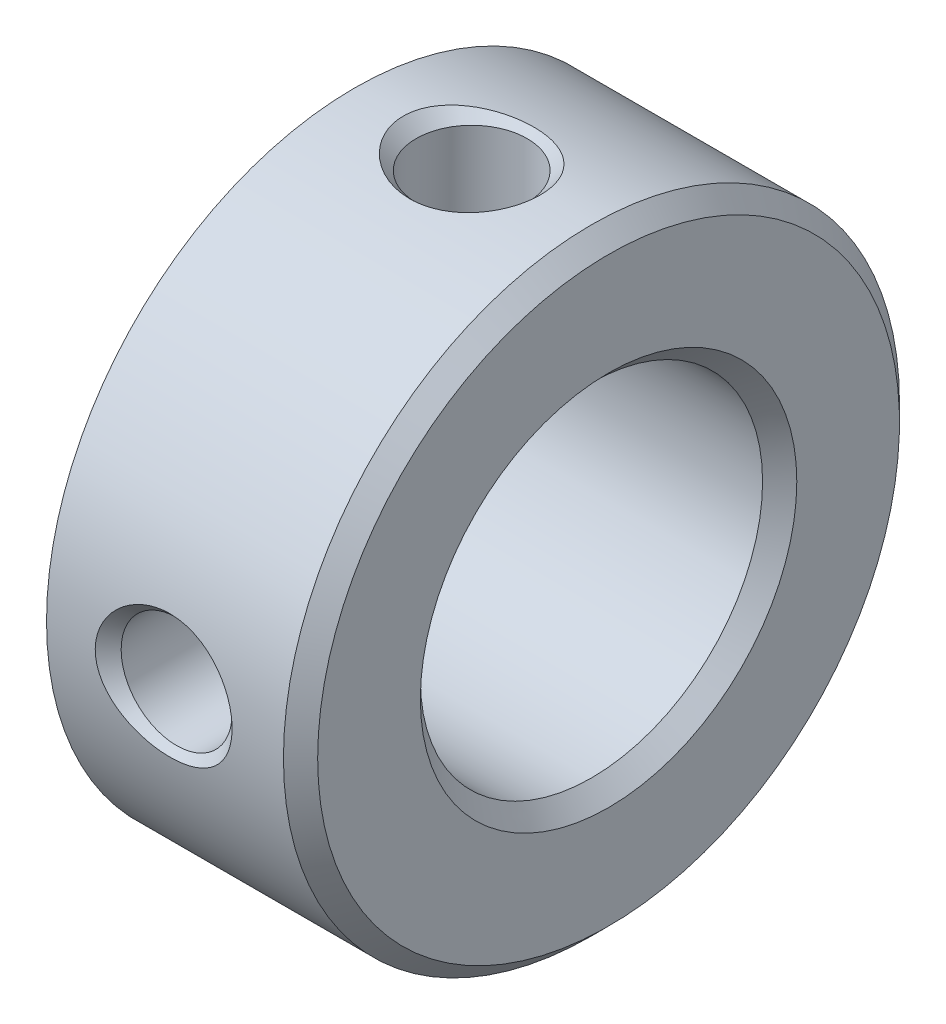
ISO-10303-21;
HEADER;
FILE_DESCRIPTION(('STEP AP214'),'2;1');
FILE_NAME('part.step','',(''),(''),'','','');
FILE_SCHEMA(('AUTOMOTIVE_DESIGN { 1 0 10303 214 1 1 1 1 }'));
ENDSEC;
DATA;
#1=APPLICATION_CONTEXT('core data for automotive mechanical design processes');
#2=APPLICATION_PROTOCOL_DEFINITION('international standard','automotive_design',2000,#1);
#3=PRODUCT_CONTEXT('',#1,'mechanical');
#4=PRODUCT('Part','Part','',(#3));
#5=PRODUCT_RELATED_PRODUCT_CATEGORY('part','',(#4));
#6=PRODUCT_DEFINITION_FORMATION('','',#4);
#7=PRODUCT_DEFINITION_CONTEXT('part definition',#1,'design');
#8=PRODUCT_DEFINITION('design','',#6,#7);
#9=PRODUCT_DEFINITION_SHAPE('','',#8);
#10=(LENGTH_UNIT() NAMED_UNIT(*) SI_UNIT(.MILLI.,.METRE.));
#11=(NAMED_UNIT(*) PLANE_ANGLE_UNIT() SI_UNIT($,.RADIAN.));
#12=(NAMED_UNIT(*) SI_UNIT($,.STERADIAN.) SOLID_ANGLE_UNIT());
#13=UNCERTAINTY_MEASURE_WITH_UNIT(LENGTH_MEASURE(1.E-05),#10,'distance_accuracy_value','');
#14=(GEOMETRIC_REPRESENTATION_CONTEXT(3) GLOBAL_UNCERTAINTY_ASSIGNED_CONTEXT((#13)) GLOBAL_UNIT_ASSIGNED_CONTEXT((#10,
#11,#12)) REPRESENTATION_CONTEXT('',''));
#15=CARTESIAN_POINT('',(0.,0.,0.));
#16=DIRECTION('',(0.,0.,1.));
#17=DIRECTION('',(1.,0.,0.));
#18=AXIS2_PLACEMENT_3D('',#15,#16,#17);
#19=CARTESIAN_POINT('',(4.0000000000191,0.,0.));
#20=DIRECTION('',(1.,0.,0.));
#21=DIRECTION('',(0.,0.,-1.));
#22=AXIS2_PLACEMENT_3D('',#19,#20,#21);
#23=CONICAL_SURFACE('',#22,5.49999999998363,0.785398163397448);
#24=CARTESIAN_POINT('',(4.0000000000191,0.,0.));
#25=DIRECTION('',(1.,0.,0.));
#26=DIRECTION('',(0.,0.,-1.));
#27=AXIS2_PLACEMENT_3D('',#24,#25,#26);
#28=CIRCLE('',#27,5.49999999998363);
#29=CARTESIAN_POINT('',(4.0000000000191,0.,-5.49999999998363));
#30=VERTEX_POINT('',#29);
#31=EDGE_CURVE('E116',#30,#30,#28,.F.);
#32=ORIENTED_EDGE('',*,*,#31,.F.);
#33=EDGE_LOOP('',(#32));
#34=FACE_BOUND('',#33,.T.);
#35=CARTESIAN_POINT('',(3.5,0.,0.));
#36=DIRECTION('',(1.,0.,0.));
#37=DIRECTION('',(0.,0.,-1.));
#38=AXIS2_PLACEMENT_3D('',#35,#36,#37);
#39=CIRCLE('',#38,5.);
#40=CARTESIAN_POINT('',(3.5,0.,-5.));
#41=VERTEX_POINT('',#40);
#42=EDGE_CURVE('E117',#41,#41,#39,.F.);
#43=ORIENTED_EDGE('',*,*,#42,.T.);
#44=EDGE_LOOP('',(#43));
#45=FACE_BOUND('',#44,.T.);
#46=ADVANCED_FACE('F15',(#34,#45),#23,.F.);
#47=CARTESIAN_POINT('',(0.,0.,6.3105));
#48=DIRECTION('',(0.,0.,1.));
#49=DIRECTION('',(1.,0.,0.));
#50=AXIS2_PLACEMENT_3D('',#47,#48,#49);
#51=CYLINDRICAL_SURFACE('',#50,1.621);
#52=CARTESIAN_POINT('',(0.,1.621,4.7299428114936));
#53=CARTESIAN_POINT('',(0.0883242228498081,1.62099495666801,4.72994698899165));
#54=CARTESIAN_POINT('',(0.176741908427207,1.61374671481636,4.73244787339607));
#55=CARTESIAN_POINT('',(0.351055857519975,1.5850020391228,4.74215007953435));
#56=CARTESIAN_POINT('',(0.436947502570778,1.56348101896145,4.74935951189662));
#57=CARTESIAN_POINT('',(0.603524042287424,1.50702106075937,4.7675736609542));
#58=CARTESIAN_POINT('',(0.684221267852952,1.47211537999241,4.77856896392495));
#59=CARTESIAN_POINT('',(0.838610035436139,1.38997281233635,4.80310370751553));
#60=CARTESIAN_POINT('',(0.912302345745859,1.34273727990673,4.81664286864159));
#61=CARTESIAN_POINT('',(1.05335823078501,1.23539208930278,4.84530578877992));
#62=CARTESIAN_POINT('',(1.12042483757003,1.17490221978386,4.86046757232822));
#63=CARTESIAN_POINT('',(1.24366524737992,1.04357520200886,4.89034562081855));
#64=CARTESIAN_POINT('',(1.29983684125703,0.972735960337547,4.90506179489632));
#65=CARTESIAN_POINT('',(1.40101358464609,0.82057820227296,4.93282554667559));
#66=CARTESIAN_POINT('',(1.44571136220709,0.739045426104684,4.94582339715119));
#67=CARTESIAN_POINT('',(1.52064193072922,0.569125871752056,4.96824175614928));
#68=CARTESIAN_POINT('',(1.55087846670559,0.480740874978997,4.97766319072258));
#69=CARTESIAN_POINT('',(1.59503214573903,0.302725730233391,4.99159902806261));
#70=CARTESIAN_POINT('',(1.60945562253032,0.213233280255262,4.99626531874226));
#71=CARTESIAN_POINT('',(1.62318116381357,0.0329849354117729,5.00070305142235));
#72=CARTESIAN_POINT('',(1.62248691454288,-0.0577706460636826,5.00047568666956));
#73=CARTESIAN_POINT('',(1.60632322734271,-0.234393693235526,4.99525592640369));
#74=CARTESIAN_POINT('',(1.59140333710298,-0.320317537198479,4.99044076600698));
#75=CARTESIAN_POINT('',(1.54811738804956,-0.488368815244508,4.97680691751369));
#76=CARTESIAN_POINT('',(1.51975037245378,-0.57049597873195,4.96798794454204));
#77=CARTESIAN_POINT('',(1.45003954655479,-0.729855170497705,4.94710600807936));
#78=CARTESIAN_POINT('',(1.4085344498836,-0.807011181818476,4.93500300803599));
#79=CARTESIAN_POINT('',(1.3138591862577,-0.9534253809761,4.90882059429379));
#80=CARTESIAN_POINT('',(1.26068652917728,-1.02268187807223,4.8947407589242));
#81=CARTESIAN_POINT('',(1.14140184620216,-1.15459862188282,4.86535445959904));
#82=CARTESIAN_POINT('',(1.07481906527925,-1.21682780413248,4.85002129307937));
#83=CARTESIAN_POINT('',(0.931999110133114,-1.32939386947531,4.82038486203933));
#84=CARTESIAN_POINT('',(0.855757296200298,-1.37972500382847,4.80608209768579));
#85=CARTESIAN_POINT('',(0.694459692640505,-1.4676233887933,4.77998110434209));
#86=CARTESIAN_POINT('',(0.609298497454268,-1.50500850150338,4.76821942684763));
#87=CARTESIAN_POINT('',(0.43350657126083,-1.56470186109034,4.74896913992852));
#88=CARTESIAN_POINT('',(0.342887874176345,-1.58704204554023,4.74147148408145));
#89=CARTESIAN_POINT('',(0.209524086406617,-1.60795244109759,4.73439813615582));
#90=CARTESIAN_POINT('',(0.167793610807641,-1.61283923748477,4.73273299529697));
#91=CARTESIAN_POINT('',(0.0840491474992081,-1.61936422533902,4.73050433607812));
#92=CARTESIAN_POINT('',(0.0420351583430463,-1.62100240021652,4.72994082334374));
#93=CARTESIAN_POINT('',(-0.0883242228498083,-1.62099495666801,4.72994698899165));
#94=CARTESIAN_POINT('',(-0.176741908427207,-1.61374671481636,4.73244787339607));
#95=CARTESIAN_POINT('',(-0.351055857519976,-1.5850020391228,4.74215007953435));
#96=CARTESIAN_POINT('',(-0.436947502570778,-1.56348101896145,4.74935951189662));
#97=CARTESIAN_POINT('',(-0.603524042287424,-1.50702106075937,4.7675736609542));
#98=CARTESIAN_POINT('',(-0.684221267852951,-1.47211537999241,4.77856896392495));
#99=CARTESIAN_POINT('',(-0.838610035436139,-1.38997281233635,4.80310370751553));
#100=CARTESIAN_POINT('',(-0.912302345745859,-1.34273727990673,4.81664286864159));
#101=CARTESIAN_POINT('',(-1.05335823078501,-1.23539208930278,4.84530578877992));
#102=CARTESIAN_POINT('',(-1.12042483757003,-1.17490221978386,4.86046757232821));
#103=CARTESIAN_POINT('',(-1.24366524737992,-1.04357520200886,4.89034562081855));
#104=CARTESIAN_POINT('',(-1.29983684125703,-0.972735960337547,4.90506179489632));
#105=CARTESIAN_POINT('',(-1.40101358464609,-0.82057820227296,4.93282554667559));
#106=CARTESIAN_POINT('',(-1.44571136220709,-0.739045426104684,4.94582339715119));
#107=CARTESIAN_POINT('',(-1.52064193072922,-0.569125871752056,4.96824175614928));
#108=CARTESIAN_POINT('',(-1.55087846670559,-0.480740874978997,4.97766319072258));
#109=CARTESIAN_POINT('',(-1.59503214573903,-0.302725730233391,4.99159902806261));
#110=CARTESIAN_POINT('',(-1.60945562253032,-0.213233280255263,4.99626531874226));
#111=CARTESIAN_POINT('',(-1.62318116381357,-0.0329849354117731,5.00070305142235));
#112=CARTESIAN_POINT('',(-1.62248691454288,0.0577706460636825,5.00047568666956));
#113=CARTESIAN_POINT('',(-1.60632322734271,0.234393693235526,4.99525592640369));
#114=CARTESIAN_POINT('',(-1.59140333710298,0.320317537198478,4.99044076600698));
#115=CARTESIAN_POINT('',(-1.54811738804956,0.488368815244508,4.97680691751369));
#116=CARTESIAN_POINT('',(-1.51975037245378,0.57049597873195,4.96798794454204));
#117=CARTESIAN_POINT('',(-1.45003954655479,0.729855170497706,4.94710600807936));
#118=CARTESIAN_POINT('',(-1.4085344498836,0.807011181818477,4.93500300803599));
#119=CARTESIAN_POINT('',(-1.3138591862577,0.9534253809761,4.90882059429379));
#120=CARTESIAN_POINT('',(-1.26068652917728,1.02268187807223,4.8947407589242));
#121=CARTESIAN_POINT('',(-1.14140184620216,1.15459862188282,4.86535445959903));
#122=CARTESIAN_POINT('',(-1.07481906527925,1.21682780413248,4.85002129307937));
#123=CARTESIAN_POINT('',(-0.931999110133115,1.32939386947531,4.82038486203933));
#124=CARTESIAN_POINT('',(-0.855757296200298,1.37972500382847,4.80608209768579));
#125=CARTESIAN_POINT('',(-0.694459692640505,1.4676233887933,4.77998110434209));
#126=CARTESIAN_POINT('',(-0.609298497454268,1.50500850150338,4.76821942684763));
#127=CARTESIAN_POINT('',(-0.43350657126083,1.56470186109034,4.74896913992852));
#128=CARTESIAN_POINT('',(-0.342887874176345,1.58704204554023,4.74147148408145));
#129=CARTESIAN_POINT('',(-0.209524086406617,1.60795244109759,4.73439813615582));
#130=CARTESIAN_POINT('',(-0.167793610807642,1.61283923748477,4.73273299529697));
#131=CARTESIAN_POINT('',(-0.0840491474992082,1.61936422533902,4.73050433607812));
#132=CARTESIAN_POINT('',(-0.0420351583430463,1.62100240021652,4.72994082334374));
#133=CARTESIAN_POINT('',(0.,1.621,4.7299428114936));
#134=B_SPLINE_CURVE_WITH_KNOTS('',3,(#52,#53,#54,#55,#56,#57,#58,#59,#60,#61,#62,#63,#64,#65,
#66,#67,#68,#69,#70,#71,#72,#73,#74,#75,#76,#77,#78,#79,#80,#81,#82,#83,#84,#85,#86,#87,#88,#89,
#90,#91,#92,#93,#94,#95,#96,#97,#98,#99,#100,#101,#102,#103,#104,#105,#106,#107,#108,#109,#110,
#111,#112,#113,#114,#115,#116,#117,#118,#119,#120,#121,#122,#123,#124,#125,#126,#127,#128,#129,
#130,#131,#132,#133),.UNSPECIFIED.,.T.,.F.,(4,2,2,2,2,2,2,2,2,2,2,2,2,2,2,2,2,2,2,2,2,2,2,2,2,2,
2,2,2,2,2,2,2,2,2,2,2,2,2,2,4),(0.,0.264809590369285,0.530076531290413,0.79468858220667,
1.05927157717112,1.33277097070679,1.60632576301808,1.88658416230314,2.16676994396102,
2.43769548297377,2.70855496147908,2.96935765010709,3.23017889800305,3.49433506090683,
3.75854765574026,4.03452570531058,4.31063682697136,4.59048820588875,4.86974362403357,
4.99577084351573,5.12179870657271,5.386608296942,5.65187523786313,5.91648728877938,
6.18107028374383,6.4545696772795,6.7281244695908,7.00838286887585,7.28856865053373,
7.55949418954648,7.83035366805179,8.0911563566798,8.35197760457576,8.61613376747954,
8.88034636231297,9.15632441188329,9.43243553354407,9.71228691246147,9.99154233060629,
10.1175695500884,10.2435974131454),.UNSPECIFIED.);
#135=CARTESIAN_POINT('',(0.,1.621,4.7299428114936));
#136=VERTEX_POINT('',#135);
#137=EDGE_CURVE('E18',#136,#136,#134,.T.);
#138=ORIENTED_EDGE('',*,*,#137,.T.);
#139=EDGE_LOOP('',(#138));
#140=FACE_BOUND('',#139,.T.);
#141=CARTESIAN_POINT('',(0.,0.,8.62099999994825));
#142=DIRECTION('',(0.,0.,1.));
#143=DIRECTION('',(0.,-1.,0.));
#144=AXIS2_PLACEMENT_3D('',#141,#142,#143);
#145=CIRCLE('',#144,1.62099999994325);
#146=CARTESIAN_POINT('',(0.,-1.62099999994325,8.62099999994825));
#147=VERTEX_POINT('',#146);
#148=EDGE_CURVE('E114',#147,#147,#145,.T.);
#149=ORIENTED_EDGE('',*,*,#148,.T.);
#150=EDGE_LOOP('',(#149));
#151=FACE_BOUND('',#150,.T.);
#152=ADVANCED_FACE('F125',(#140,#151),#51,.F.);
#153=CARTESIAN_POINT('',(-4.0000000000191,0.,0.));
#154=DIRECTION('',(-1.,0.,0.));
#155=DIRECTION('',(0.,0.,1.));
#156=AXIS2_PLACEMENT_3D('',#153,#154,#155);
#157=CONICAL_SURFACE('',#156,5.49999999998363,0.785398163397448);
#158=CARTESIAN_POINT('',(-3.5,0.,0.));
#159=DIRECTION('',(1.,0.,0.));
#160=DIRECTION('',(0.,0.,-1.));
#161=AXIS2_PLACEMENT_3D('',#158,#159,#160);
#162=CIRCLE('',#161,5.);
#163=CARTESIAN_POINT('',(-3.5,0.,-5.));
#164=VERTEX_POINT('',#163);
#165=EDGE_CURVE('E38',#164,#164,#162,.T.);
#166=ORIENTED_EDGE('',*,*,#165,.T.);
#167=EDGE_LOOP('',(#166));
#168=FACE_BOUND('',#167,.T.);
#169=CARTESIAN_POINT('',(-4.0000000000191,0.,0.));
#170=DIRECTION('',(-1.,0.,0.));
#171=DIRECTION('',(0.,0.,1.));
#172=AXIS2_PLACEMENT_3D('',#169,#170,#171);
#173=CIRCLE('',#172,5.49999999998363);
#174=CARTESIAN_POINT('',(-4.0000000000191,0.,5.49999999998363));
#175=VERTEX_POINT('',#174);
#176=EDGE_CURVE('E81',#175,#175,#173,.F.);
#177=ORIENTED_EDGE('',*,*,#176,.F.);
#178=EDGE_LOOP('',(#177));
#179=FACE_BOUND('',#178,.T.);
#180=ADVANCED_FACE('F73',(#168,#179),#157,.F.);
#181=CARTESIAN_POINT('',(0.,0.,0.));
#182=DIRECTION('',(1.,0.,0.));
#183=DIRECTION('',(0.,0.,-1.));
#184=AXIS2_PLACEMENT_3D('',#181,#182,#183);
#185=CYLINDRICAL_SURFACE('',#184,5.);
#186=ORIENTED_EDGE('',*,*,#165,.F.);
#187=EDGE_LOOP('',(#186));
#188=FACE_BOUND('',#187,.T.);
#189=CARTESIAN_POINT('',(0.,4.7299428114936,1.621));
#190=CARTESIAN_POINT('',(0.0883879395672359,4.7299460726129,1.62099615382014));
#191=CARTESIAN_POINT('',(0.176820959564406,4.73244969190483,1.61374112191029));
#192=CARTESIAN_POINT('',(0.351117785997567,4.74215611922495,1.5849843593927));
#193=CARTESIAN_POINT('',(0.436979153964272,4.74936324828994,1.56346952825927));
#194=CARTESIAN_POINT('',(0.603519537278842,4.76757289344653,1.50702334874817));
#195=CARTESIAN_POINT('',(0.684209269290979,4.77856723879521,1.47212086535421));
#196=CARTESIAN_POINT('',(0.838598083385425,4.80310162588651,1.38998007050231));
#197=CARTESIAN_POINT('',(0.912296852067883,4.8166417816749,1.34274120636923));
#198=CARTESIAN_POINT('',(1.0533533252904,4.84530476162284,1.23539608526392));
#199=CARTESIAN_POINT('',(1.12041536289458,4.8604654416043,1.17491132632733));
#200=CARTESIAN_POINT('',(1.24365733591412,4.89034353612307,1.04358462264169));
#201=CARTESIAN_POINT('',(1.29983352875819,4.90506079674867,0.972739130492266));
#202=CARTESIAN_POINT('',(1.40103725259501,4.93283213275176,0.820544465073783));
#203=CARTESIAN_POINT('',(1.44575219604474,4.94583564315422,0.73897759701253));
#204=CARTESIAN_POINT('',(1.52067124435153,4.96825050056049,0.569034641163643));
#205=CARTESIAN_POINT('',(1.55089256871116,4.97766610751451,0.480666779111124));
#206=CARTESIAN_POINT('',(1.58911672955297,4.98973307709506,0.32658715025848));
#207=CARTESIAN_POINT('',(1.60104891603746,4.99356184924025,0.261915386126397));
#208=CARTESIAN_POINT('',(1.61699167239445,4.99869621532877,0.131503946543916));
#209=CARTESIAN_POINT('',(1.62100277776454,5.00000197983763,0.0657643435867669));
#210=CARTESIAN_POINT('',(1.62099626084217,4.99999733493417,-0.0885255955464695));
#211=CARTESIAN_POINT('',(1.61371938986869,4.99762504507006,-0.177096020963262));
#212=CARTESIAN_POINT('',(1.58486797625319,4.9883850266478,-0.351678867713105));
#213=CARTESIAN_POINT('',(1.56328082611174,4.98151333413636,-0.437688963488835));
#214=CARTESIAN_POINT('',(1.50662347558519,4.96402578679964,-0.604544986591142));
#215=CARTESIAN_POINT('',(1.47157888655898,4.95341704724089,-0.685400385252581));
#216=CARTESIAN_POINT('',(1.38910254724635,4.9295447692433,-0.840071913564747));
#217=CARTESIAN_POINT('',(1.341670556754,4.91628117932504,-0.913887906675423));
#218=CARTESIAN_POINT('',(1.23412056820324,4.88801042598162,-1.05483523567841));
#219=CARTESIAN_POINT('',(1.17366761131566,4.87296317580924,-1.12170289832987));
#220=CARTESIAN_POINT('',(1.04248874357489,4.84304346253043,-1.24456315018154));
#221=CARTESIAN_POINT('',(0.97175875754015,4.82817107130195,-1.30055140465536));
#222=CARTESIAN_POINT('',(0.819688056992398,4.79984606653351,-1.40153822316147));
#223=CARTESIAN_POINT('',(0.738110234518086,4.78644334660164,-1.4461947300554));
#224=CARTESIAN_POINT('',(0.56814564903648,4.76320273836648,-1.52100253546362));
#225=CARTESIAN_POINT('',(0.479767423205628,4.7533604660691,-1.55117168741765));
#226=CARTESIAN_POINT('',(0.325820975673771,4.74072730436039,-1.58926692611162));
#227=CARTESIAN_POINT('',(0.261304146071917,4.73670911879916,-1.6011423667579));
#228=CARTESIAN_POINT('',(0.13119976510088,4.73131577176562,-1.61701000375735));
#229=CARTESIAN_POINT('',(0.0656123031511083,4.72994039069333,-1.62100285510353));
#230=CARTESIAN_POINT('',(-0.088387939567236,4.72994607261289,-1.62099615382014));
#231=CARTESIAN_POINT('',(-0.176820959564406,4.73244969190483,-1.61374112191029));
#232=CARTESIAN_POINT('',(-0.351117785997567,4.74215611922495,-1.5849843593927));
#233=CARTESIAN_POINT('',(-0.436979153964272,4.74936324828994,-1.56346952825927));
#234=CARTESIAN_POINT('',(-0.603519537278842,4.76757289344653,-1.50702334874817));
#235=CARTESIAN_POINT('',(-0.684209269290978,4.77856723879522,-1.47212086535421));
#236=CARTESIAN_POINT('',(-0.838598083385424,4.80310162588651,-1.38998007050231));
#237=CARTESIAN_POINT('',(-0.912296852067883,4.8166417816749,-1.34274120636923));
#238=CARTESIAN_POINT('',(-1.0533533252904,4.84530476162284,-1.23539608526392));
#239=CARTESIAN_POINT('',(-1.12041536289458,4.8604654416043,-1.17491132632733));
#240=CARTESIAN_POINT('',(-1.24365733591412,4.89034353612307,-1.04358462264169));
#241=CARTESIAN_POINT('',(-1.29983352875819,4.90506079674867,-0.972739130492266));
#242=CARTESIAN_POINT('',(-1.40103725259501,4.93283213275176,-0.820544465073783));
#243=CARTESIAN_POINT('',(-1.44575219604474,4.94583564315422,-0.73897759701253));
#244=CARTESIAN_POINT('',(-1.52067124435153,4.96825050056049,-0.569034641163643));
#245=CARTESIAN_POINT('',(-1.55089256871116,4.97766610751451,-0.480666779111124));
#246=CARTESIAN_POINT('',(-1.58911672955297,4.98973307709506,-0.32658715025848));
#247=CARTESIAN_POINT('',(-1.60104891603746,4.99356184924025,-0.261915386126397));
#248=CARTESIAN_POINT('',(-1.61699167239445,4.99869621532877,-0.131503946543916));
#249=CARTESIAN_POINT('',(-1.62100277776454,5.00000197983763,-0.0657643435867674));
#250=CARTESIAN_POINT('',(-1.62099626084217,4.99999733493417,0.088525595546469));
#251=CARTESIAN_POINT('',(-1.61371938986869,4.99762504507006,0.177096020963261));
#252=CARTESIAN_POINT('',(-1.58486797625319,4.9883850266478,0.351678867713105));
#253=CARTESIAN_POINT('',(-1.56328082611174,4.98151333413636,0.437688963488834));
#254=CARTESIAN_POINT('',(-1.50662347558519,4.96402578679964,0.604544986591141));
#255=CARTESIAN_POINT('',(-1.47157888655898,4.95341704724089,0.68540038525258));
#256=CARTESIAN_POINT('',(-1.38910254724635,4.9295447692433,0.840071913564747));
#257=CARTESIAN_POINT('',(-1.341670556754,4.91628117932504,0.913887906675423));
#258=CARTESIAN_POINT('',(-1.23412056820324,4.88801042598162,1.05483523567841));
#259=CARTESIAN_POINT('',(-1.17366761131566,4.87296317580924,1.12170289832987));
#260=CARTESIAN_POINT('',(-1.04248874357489,4.84304346253043,1.24456315018154));
#261=CARTESIAN_POINT('',(-0.971758757540151,4.82817107130195,1.30055140465536));
#262=CARTESIAN_POINT('',(-0.819688056992398,4.79984606653351,1.40153822316147));
#263=CARTESIAN_POINT('',(-0.738110234518087,4.78644334660164,1.44619473005539));
#264=CARTESIAN_POINT('',(-0.568145649036481,4.76320273836648,1.52100253546362));
#265=CARTESIAN_POINT('',(-0.479767423205629,4.7533604660691,1.55117168741765));
#266=CARTESIAN_POINT('',(-0.325820975673772,4.74072730436039,1.58926692611162));
#267=CARTESIAN_POINT('',(-0.261304146071917,4.73670911879916,1.6011423667579));
#268=CARTESIAN_POINT('',(-0.131199765100881,4.73131577176562,1.61701000375735));
#269=CARTESIAN_POINT('',(-0.0656123031511085,4.72994039069334,1.62100285510353));
#270=CARTESIAN_POINT('',(0.,4.7299428114936,1.621));
#271=B_SPLINE_CURVE_WITH_KNOTS('',3,(#189,#190,#191,#192,#193,#194,#195,#196,#197,#198,#199,
#200,#201,#202,#203,#204,#205,#206,#207,#208,#209,#210,#211,#212,#213,#214,#215,#216,#217,#218,
#219,#220,#221,#222,#223,#224,#225,#226,#227,#228,#229,#230,#231,#232,#233,#234,#235,#236,#237,
#238,#239,#240,#241,#242,#243,#244,#245,#246,#247,#248,#249,#250,#251,#252,#253,#254,#255,#256,
#257,#258,#259,#260,#261,#262,#263,#264,#265,#266,#267,#268,#269,#270),.UNSPECIFIED.,.T.,.F.,(4,
2,2,2,2,2,2,2,2,2,2,2,2,2,2,2,2,2,2,2,2,2,2,2,2,2,2,2,2,2,2,2,2,2,2,2,2,2,2,2,4),(0.,
0.26491640290383,0.53007652338082,0.794668119502865,1.05927157147554,1.33275173579368,
1.6063257568732,1.88671483229574,2.1667699541857,2.36389319006473,2.56100309914778,
2.82633338510532,3.09189774092573,3.35695917612807,3.62202575155762,3.89496544056384,
4.16801365604414,4.44852213470529,4.72868403693406,4.92535362690224,5.12200687419063,
5.38692327709447,5.65208339757145,5.9166749936935,6.18127844566617,6.45475860998431,
6.72833263106384,7.00872170648637,7.28877682837634,7.48590006425537,7.68300997333841,
7.94834025929596,8.21390461511636,8.4789660503187,8.74403262574825,9.01697231475448,
9.29002053023477,9.57052900889592,9.8506909111247,10.0473605010929,10.2440137483813),.UNSPECIFIED.);
#272=CARTESIAN_POINT('',(0.,4.7299428114936,1.621));
#273=VERTEX_POINT('',#272);
#274=EDGE_CURVE('E76',#273,#273,#271,.T.);
#275=ORIENTED_EDGE('',*,*,#274,.T.);
#276=EDGE_LOOP('',(#275));
#277=FACE_BOUND('',#276,.T.);
#278=ORIENTED_EDGE('',*,*,#42,.F.);
#279=EDGE_LOOP('',(#278));
#280=FACE_BOUND('',#279,.T.);
#281=ORIENTED_EDGE('',*,*,#137,.F.);
#282=EDGE_LOOP('',(#281));
#283=FACE_BOUND('',#282,.T.);
#284=ADVANCED_FACE('F68',(#188,#277,#280,#283),#185,.F.);
#285=CARTESIAN_POINT('',(4.,7.,0.));
#286=DIRECTION('',(1.,0.,0.));
#287=DIRECTION('',(0.,0.,-1.));
#288=AXIS2_PLACEMENT_3D('',#285,#286,#287);
#289=PLANE('',#288);
#290=ORIENTED_EDGE('',*,*,#31,.T.);
#291=EDGE_LOOP('',(#290));
#292=FACE_BOUND('',#291,.T.);
#293=CARTESIAN_POINT('',(4.,0.,0.));
#294=DIRECTION('',(-1.,0.,0.));
#295=DIRECTION('',(0.,0.,1.));
#296=AXIS2_PLACEMENT_3D('',#293,#294,#295);
#297=CIRCLE('',#296,8.5);
#298=CARTESIAN_POINT('',(4.,0.,8.5));
#299=VERTEX_POINT('',#298);
#300=EDGE_CURVE('E56',#299,#299,#297,.T.);
#301=ORIENTED_EDGE('',*,*,#300,.F.);
#302=EDGE_LOOP('',(#301));
#303=FACE_BOUND('',#302,.T.);
#304=ADVANCED_FACE('F64',(#292,#303),#289,.T.);
#305=CARTESIAN_POINT('',(0.,0.,9.00227399995401));
#306=DIRECTION('',(0.,0.,1.));
#307=DIRECTION('',(1.,0.,0.));
#308=AXIS2_PLACEMENT_3D('',#305,#306,#307);
#309=CONICAL_SURFACE('',#308,2.00227399994901,0.785398163397448);
#310=ORIENTED_EDGE('',*,*,#148,.F.);
#311=EDGE_LOOP('',(#310));
#312=FACE_BOUND('',#311,.T.);
#313=CARTESIAN_POINT('',(0.,1.81507290636318,8.81507290636818));
#314=CARTESIAN_POINT('',(0.120187723832694,1.81507022283642,8.81507478505047));
#315=CARTESIAN_POINT('',(0.240413387361276,1.80515481301193,8.81713291455179));
#316=CARTESIAN_POINT('',(0.477512070458263,1.76564965935597,8.82512758241663));
#317=CARTESIAN_POINT('',(0.594383192532897,1.73604900076806,8.83106627237831));
#318=CARTESIAN_POINT('',(0.821177849482622,1.65773178546549,8.84610126068527));
#319=CARTESIAN_POINT('',(0.931109981133526,1.60903944358785,8.85519355749065));
#320=CARTESIAN_POINT('',(1.14072719976992,1.49338434129233,8.87542872898206));
#321=CARTESIAN_POINT('',(1.24041383423559,1.42642434562107,8.88657129328413));
#322=CARTESIAN_POINT('',(1.42273812205556,1.27813502819688,8.90908453577714));
#323=CARTESIAN_POINT('',(1.50584639926415,1.19738317793663,8.92043397490782));
#324=CARTESIAN_POINT('',(1.65576270709495,1.02174937565431,8.94224921460266));
#325=CARTESIAN_POINT('',(1.72257447872874,0.92687067464871,8.95271521760621));
#326=CARTESIAN_POINT('',(1.83149910595014,0.734437449977917,8.97045781460458));
#327=CARTESIAN_POINT('',(1.87525234483871,0.637829870705439,8.97793238474492));
#328=CARTESIAN_POINT('',(1.94389621755219,0.438113417507654,8.98988179883252));
#329=CARTESIAN_POINT('',(1.96884200112136,0.335024519735889,8.99436540878549));
#330=CARTESIAN_POINT('',(1.98911233350217,0.192434890260843,8.99802471122645));
#331=CARTESIAN_POINT('',(1.99318911685877,0.154073810398632,8.99876331169823));
#332=CARTESIAN_POINT('',(1.99863463839297,0.0771489082677726,8.99975151743143));
#333=CARTESIAN_POINT('',(2.00000309572124,0.0385850653886114,9.00000107197951));
#334=CARTESIAN_POINT('',(1.99999200150595,-0.0996929956484287,8.99999723030538));
#335=CARTESIAN_POINT('',(1.99082805279401,-0.199527664445766,8.99832137621677));
#336=CARTESIAN_POINT('',(1.95464240230793,-0.39591310387582,8.99182733038328));
#337=CARTESIAN_POINT('',(1.92758428756366,-0.492456755474151,8.98700273149773));
#338=CARTESIAN_POINT('',(1.85993213201227,-0.671514074997421,8.97532527411032));
#339=CARTESIAN_POINT('',(1.82062016447572,-0.754529998389324,8.96866963455526));
#340=CARTESIAN_POINT('',(1.72971085194803,-0.913302572892093,8.95389531888979));
#341=CARTESIAN_POINT('',(1.67811879335801,-0.989062328051585,8.94577727268891));
#342=CARTESIAN_POINT('',(1.55985193009782,-1.13764445262415,8.92814650664277));
#343=CARTESIAN_POINT('',(1.49231087561684,-1.20976900976823,8.91857432729899));
#344=CARTESIAN_POINT('',(1.34700220345799,-1.34288337441935,8.89950541834044));
#345=CARTESIAN_POINT('',(1.26922831625565,-1.40386630043171,8.89000873879702));
#346=CARTESIAN_POINT('',(1.09733151445815,-1.51931907533833,8.87104471869932));
#347=CARTESIAN_POINT('',(1.00235152469207,-1.57252985352077,8.86167506587933));
#348=CARTESIAN_POINT('',(0.805162669578235,-1.66360394330228,8.84503095343481));
#349=CARTESIAN_POINT('',(0.702954260809504,-1.70146822323921,8.83775636162389));
#350=CARTESIAN_POINT('',(0.501368944070869,-1.75917197827863,8.82644400021133));
#351=CARTESIAN_POINT('',(0.402315305510119,-1.78011007593777,8.8222113915609));
#352=CARTESIAN_POINT('',(0.202183563213046,-1.80806254638457,8.81652487928484));
#353=CARTESIAN_POINT('',(0.101105205876096,-1.8150751638194,8.81507132596917));
#354=CARTESIAN_POINT('',(-0.120187723832694,-1.81507022283642,8.81507478505047));
#355=CARTESIAN_POINT('',(-0.240413387361277,-1.80515481301193,8.81713291455179));
#356=CARTESIAN_POINT('',(-0.477512070458263,-1.76564965935597,8.82512758241663));
#357=CARTESIAN_POINT('',(-0.594383192532898,-1.73604900076806,8.83106627237831));
#358=CARTESIAN_POINT('',(-0.821177849482623,-1.65773178546549,8.84610126068527));
#359=CARTESIAN_POINT('',(-0.931109981133527,-1.60903944358786,8.85519355749065));
#360=CARTESIAN_POINT('',(-1.14072719976992,-1.49338434129233,8.87542872898206));
#361=CARTESIAN_POINT('',(-1.24041383423559,-1.42642434562107,8.88657129328413));
#362=CARTESIAN_POINT('',(-1.42273812205556,-1.27813502819688,8.90908453577714));
#363=CARTESIAN_POINT('',(-1.50584639926415,-1.19738317793663,8.92043397490782));
#364=CARTESIAN_POINT('',(-1.65576270709496,-1.02174937565431,8.94224921460266));
#365=CARTESIAN_POINT('',(-1.72257447872874,-0.92687067464871,8.95271521760621));
#366=CARTESIAN_POINT('',(-1.83149910595014,-0.734437449977917,8.97045781460458));
#367=CARTESIAN_POINT('',(-1.87525234483871,-0.63782987070544,8.97793238474492));
#368=CARTESIAN_POINT('',(-1.94389621755219,-0.438113417507655,8.98988179883252));
#369=CARTESIAN_POINT('',(-1.96884200112136,-0.33502451973589,8.99436540878549));
#370=CARTESIAN_POINT('',(-1.98911233350216,-0.192434890260843,8.99802471122645));
#371=CARTESIAN_POINT('',(-1.99318911685877,-0.154073810398632,8.99876331169823));
#372=CARTESIAN_POINT('',(-1.99863463839297,-0.0771489082677727,8.99975151743143));
#373=CARTESIAN_POINT('',(-2.00000309572126,-0.0385850653886122,9.00000107197951));
#374=CARTESIAN_POINT('',(-1.99999200150598,0.0996929956484271,8.99999723030538));
#375=CARTESIAN_POINT('',(-1.99082805279402,0.199527664445764,8.99832137621677));
#376=CARTESIAN_POINT('',(-1.95464240230793,0.395913103875819,8.99182733038328));
#377=CARTESIAN_POINT('',(-1.92758428756366,0.492456755474151,8.98700273149773));
#378=CARTESIAN_POINT('',(-1.85993213201227,0.671514074997423,8.97532527411032));
#379=CARTESIAN_POINT('',(-1.82062016447572,0.754529998389326,8.96866963455526));
#380=CARTESIAN_POINT('',(-1.72971085194803,0.913302572892095,8.95389531888979));
#381=CARTESIAN_POINT('',(-1.67811879335801,0.989062328051587,8.94577727268891));
#382=CARTESIAN_POINT('',(-1.55985193009782,1.13764445262415,8.92814650664277));
#383=CARTESIAN_POINT('',(-1.49231087561684,1.20976900976823,8.91857432729899));
#384=CARTESIAN_POINT('',(-1.34700220345799,1.34288337441935,8.89950541834044));
#385=CARTESIAN_POINT('',(-1.26922831625565,1.40386630043171,8.89000873879702));
#386=CARTESIAN_POINT('',(-1.09733151445814,1.51931907533833,8.87104471869932));
#387=CARTESIAN_POINT('',(-1.00235152469207,1.57252985352077,8.86167506587933));
#388=CARTESIAN_POINT('',(-0.805162669578234,1.66360394330228,8.84503095343481));
#389=CARTESIAN_POINT('',(-0.702954260809503,1.70146822323921,8.83775636162389));
#390=CARTESIAN_POINT('',(-0.501368944070867,1.75917197827863,8.82644400021133));
#391=CARTESIAN_POINT('',(-0.402315305510117,1.78011007593777,8.8222113915609));
#392=CARTESIAN_POINT('',(-0.202183563213045,1.80806254638457,8.81652487928484));
#393=CARTESIAN_POINT('',(-0.101105205876096,1.8150751638194,8.81507132596917));
#394=CARTESIAN_POINT('',(0.,1.81507290636318,8.81507290636818));
#395=B_SPLINE_CURVE_WITH_KNOTS('',3,(#313,#314,#315,#316,#317,#318,#319,#320,#321,#322,#323,
#324,#325,#326,#327,#328,#329,#330,#331,#332,#333,#334,#335,#336,#337,#338,#339,#340,#341,#342,
#343,#344,#345,#346,#347,#348,#349,#350,#351,#352,#353,#354,#355,#356,#357,#358,#359,#360,#361,
#362,#363,#364,#365,#366,#367,#368,#369,#370,#371,#372,#373,#374,#375,#376,#377,#378,#379,#380,
#381,#382,#383,#384,#385,#386,#387,#388,#389,#390,#391,#392,#393,#394),.UNSPECIFIED.,.T.,.F.,(4,
2,2,2,2,2,2,2,2,2,2,2,2,2,2,2,2,2,2,2,2,2,2,2,2,2,2,2,2,2,2,2,2,2,2,2,2,2,2,2,4),(0.,
0.360204573981947,0.720609035036693,1.08055785003306,1.440452218206,1.7878917606537,
2.13525146996186,2.4524631852805,2.76874107278242,2.88441707584172,3.00010507369938,
3.2990104390484,3.59852592845506,3.87364478315686,4.14864541670094,4.44524058802392,
4.74201833303444,5.06844106516049,5.39484319736143,5.6978189642619,6.0008329198357,
6.36103749381765,6.72144195487239,7.08139076986876,7.4412851380417,7.7887246804894,
8.13608438979756,8.4532961051162,8.76957399261812,8.88524999567742,9.00093799353508,
9.2998433588841,9.59935884829076,9.87447770299256,10.1494783365366,10.4460735078596,
10.7428512528701,11.0692739849962,11.3956761171971,11.6986518840976,12.0016658396714),.UNSPECIFIED.);
#396=CARTESIAN_POINT('',(0.,1.81507290636318,8.81507290636818));
#397=VERTEX_POINT('',#396);
#398=EDGE_CURVE('E50',#397,#397,#395,.T.);
#399=ORIENTED_EDGE('',*,*,#398,.F.);
#400=EDGE_LOOP('',(#399));
#401=FACE_BOUND('',#400,.T.);
#402=ADVANCED_FACE('F58',(#312,#401),#309,.F.);
#403=CARTESIAN_POINT('',(-4.,6.75,0.));
#404=DIRECTION('',(-1.,0.,0.));
#405=DIRECTION('',(0.,0.,1.));
#406=AXIS2_PLACEMENT_3D('',#403,#404,#405);
#407=PLANE('',#406);
#408=CARTESIAN_POINT('',(-4.,0.,0.));
#409=DIRECTION('',(1.,0.,0.));
#410=DIRECTION('',(0.,0.,-1.));
#411=AXIS2_PLACEMENT_3D('',#408,#409,#410);
#412=CIRCLE('',#411,8.);
#413=CARTESIAN_POINT('',(-4.,0.,-8.));
#414=VERTEX_POINT('',#413);
#415=EDGE_CURVE('E40',#414,#414,#412,.T.);
#416=ORIENTED_EDGE('',*,*,#415,.F.);
#417=EDGE_LOOP('',(#416));
#418=FACE_BOUND('',#417,.T.);
#419=ORIENTED_EDGE('',*,*,#176,.T.);
#420=EDGE_LOOP('',(#419));
#421=FACE_BOUND('',#420,.T.);
#422=ADVANCED_FACE('F63',(#418,#421),#407,.T.);
#423=CARTESIAN_POINT('',(0.,6.3105,0.));
#424=DIRECTION('',(0.,1.,0.));
#425=DIRECTION('',(0.,0.,1.));
#426=AXIS2_PLACEMENT_3D('',#423,#424,#425);
#427=CYLINDRICAL_SURFACE('',#426,1.621);
#428=CARTESIAN_POINT('',(0.,8.62099999994825,0.));
#429=DIRECTION('',(0.,1.,0.));
#430=DIRECTION('',(0.,0.,1.));
#431=AXIS2_PLACEMENT_3D('',#428,#429,#430);
#432=CIRCLE('',#431,1.62099999994325);
#433=CARTESIAN_POINT('',(0.,8.62099999994825,1.62099999994325));
#434=VERTEX_POINT('',#433);
#435=EDGE_CURVE('E109',#434,#434,#432,.T.);
#436=ORIENTED_EDGE('',*,*,#435,.T.);
#437=EDGE_LOOP('',(#436));
#438=FACE_BOUND('',#437,.T.);
#439=ORIENTED_EDGE('',*,*,#274,.F.);
#440=EDGE_LOOP('',(#439));
#441=FACE_BOUND('',#440,.T.);
#442=ADVANCED_FACE('F82',(#438,#441),#427,.F.);
#443=CARTESIAN_POINT('',(3.5,0.,0.));
#444=DIRECTION('',(-1.,0.,0.));
#445=DIRECTION('',(0.,0.,1.));
#446=AXIS2_PLACEMENT_3D('',#443,#444,#445);
#447=CONICAL_SURFACE('',#446,9.,0.785398163397448);
#448=ORIENTED_EDGE('',*,*,#300,.T.);
#449=EDGE_LOOP('',(#448));
#450=FACE_BOUND('',#449,.T.);
#451=CARTESIAN_POINT('',(3.5,0.,0.));
#452=DIRECTION('',(1.,0.,0.));
#453=DIRECTION('',(0.,0.,-1.));
#454=AXIS2_PLACEMENT_3D('',#451,#452,#453);
#455=CIRCLE('',#454,9.);
#456=CARTESIAN_POINT('',(3.5,0.,-9.));
#457=VERTEX_POINT('',#456);
#458=EDGE_CURVE('E30',#457,#457,#455,.F.);
#459=ORIENTED_EDGE('',*,*,#458,.F.);
#460=EDGE_LOOP('',(#459));
#461=FACE_BOUND('',#460,.T.);
#462=ADVANCED_FACE('F86',(#450,#461),#447,.T.);
#463=CARTESIAN_POINT('',(-3.42264973081038,0.,0.));
#464=DIRECTION('',(1.,0.,0.));
#465=DIRECTION('',(0.,0.,-1.));
#466=AXIS2_PLACEMENT_3D('',#463,#464,#465);
#467=CONICAL_SURFACE('',#466,9.00000000000001,1.0471975511966);
#468=ORIENTED_EDGE('',*,*,#415,.T.);
#469=EDGE_LOOP('',(#468));
#470=FACE_BOUND('',#469,.T.);
#471=CARTESIAN_POINT('',(-3.42264973081037,0.,0.));
#472=DIRECTION('',(1.,0.,0.));
#473=DIRECTION('',(0.,0.,-1.));
#474=AXIS2_PLACEMENT_3D('',#471,#472,#473);
#475=CIRCLE('',#474,9.);
#476=CARTESIAN_POINT('',(-3.42264973081037,0.,-9.));
#477=VERTEX_POINT('',#476);
#478=EDGE_CURVE('E25',#477,#477,#475,.T.);
#479=ORIENTED_EDGE('',*,*,#478,.F.);
#480=EDGE_LOOP('',(#479));
#481=FACE_BOUND('',#480,.T.);
#482=ADVANCED_FACE('F89',(#470,#481),#467,.T.);
#483=CARTESIAN_POINT('',(0.,9.00227399995401,0.));
#484=DIRECTION('',(0.,1.,0.));
#485=DIRECTION('',(0.,0.,1.));
#486=AXIS2_PLACEMENT_3D('',#483,#484,#485);
#487=CONICAL_SURFACE('',#486,2.00227399994901,0.785398163397448);
#488=CARTESIAN_POINT('',(0.,8.81507290636818,1.81507290636318));
#489=CARTESIAN_POINT('',(-0.120187723832694,8.81507478505047,1.81507022283643));
#490=CARTESIAN_POINT('',(-0.240413387361276,8.81713291455179,1.80515481301193));
#491=CARTESIAN_POINT('',(-0.477512070458263,8.82512758241663,1.76564965935597));
#492=CARTESIAN_POINT('',(-0.594383192532897,8.83106627237831,1.73604900076806));
#493=CARTESIAN_POINT('',(-0.821177849482622,8.84610126068527,1.65773178546549));
#494=CARTESIAN_POINT('',(-0.931109981133526,8.85519355749065,1.60903944358785));
#495=CARTESIAN_POINT('',(-1.14072719976992,8.87542872898206,1.49338434129233));
#496=CARTESIAN_POINT('',(-1.24041383423559,8.88657129328413,1.42642434562107));
#497=CARTESIAN_POINT('',(-1.42273812205556,8.90908453577714,1.27813502819688));
#498=CARTESIAN_POINT('',(-1.50584639926415,8.92043397490782,1.19738317793663));
#499=CARTESIAN_POINT('',(-1.65576270709495,8.94224921460266,1.02174937565431));
#500=CARTESIAN_POINT('',(-1.72257447872874,8.95271521760621,0.926870674648709));
#501=CARTESIAN_POINT('',(-1.83149910595014,8.97045781460458,0.734437449977916));
#502=CARTESIAN_POINT('',(-1.87525234483871,8.97793238474492,0.637829870705439));
#503=CARTESIAN_POINT('',(-1.94389621755219,8.98988179883252,0.438113417507654));
#504=CARTESIAN_POINT('',(-1.96884200112136,8.99436540878549,0.335024519735889));
#505=CARTESIAN_POINT('',(-1.98911233350217,8.99802471122645,0.192434890260843));
#506=CARTESIAN_POINT('',(-1.99318911685877,8.99876331169823,0.154073810398632));
#507=CARTESIAN_POINT('',(-1.99863463839297,8.99975151743143,0.0771489082677719));
#508=CARTESIAN_POINT('',(-2.00000309572124,9.00000107197951,0.0385850653886107));
#509=CARTESIAN_POINT('',(-1.99999200150595,8.99999723030538,-0.0996929956484296));
#510=CARTESIAN_POINT('',(-1.99082805279401,8.99832137621677,-0.199527664445767));
#511=CARTESIAN_POINT('',(-1.95464240230793,8.99182733038328,-0.39591310387582));
#512=CARTESIAN_POINT('',(-1.92758428756366,8.98700273149773,-0.492456755474152));
#513=CARTESIAN_POINT('',(-1.85993213201227,8.97532527411032,-0.671514074997422));
#514=CARTESIAN_POINT('',(-1.82062016447572,8.96866963455526,-0.754529998389325));
#515=CARTESIAN_POINT('',(-1.72971085194803,8.95389531888979,-0.913302572892094));
#516=CARTESIAN_POINT('',(-1.67811879335801,8.94577727268891,-0.989062328051586));
#517=CARTESIAN_POINT('',(-1.55985193009782,8.92814650664277,-1.13764445262415));
#518=CARTESIAN_POINT('',(-1.49231087561684,8.91857432729899,-1.20976900976823));
#519=CARTESIAN_POINT('',(-1.34700220345799,8.89950541834044,-1.34288337441935));
#520=CARTESIAN_POINT('',(-1.26922831625565,8.89000873879702,-1.40386630043171));
#521=CARTESIAN_POINT('',(-1.09733151445815,8.87104471869932,-1.51931907533833));
#522=CARTESIAN_POINT('',(-1.00235152469207,8.86167506587933,-1.57252985352077));
#523=CARTESIAN_POINT('',(-0.805162669578234,8.84503095343481,-1.66360394330228));
#524=CARTESIAN_POINT('',(-0.702954260809503,8.83775636162389,-1.70146822323921));
#525=CARTESIAN_POINT('',(-0.501368944070868,8.82644400021133,-1.75917197827863));
#526=CARTESIAN_POINT('',(-0.402315305510118,8.8222113915609,-1.78011007593777));
#527=CARTESIAN_POINT('',(-0.202183563213046,8.81652487928483,-1.80806254638457));
#528=CARTESIAN_POINT('',(-0.101105205876096,8.81507132596917,-1.8150751638194));
#529=CARTESIAN_POINT('',(0.120187723832694,8.81507478505047,-1.81507022283643));
#530=CARTESIAN_POINT('',(0.240413387361277,8.81713291455179,-1.80515481301193));
#531=CARTESIAN_POINT('',(0.477512070458263,8.82512758241663,-1.76564965935597));
#532=CARTESIAN_POINT('',(0.594383192532898,8.83106627237831,-1.73604900076806));
#533=CARTESIAN_POINT('',(0.821177849482623,8.84610126068527,-1.65773178546549));
#534=CARTESIAN_POINT('',(0.931109981133527,8.85519355749065,-1.60903944358786));
#535=CARTESIAN_POINT('',(1.14072719976992,8.87542872898206,-1.49338434129233));
#536=CARTESIAN_POINT('',(1.24041383423559,8.88657129328413,-1.42642434562107));
#537=CARTESIAN_POINT('',(1.42273812205556,8.90908453577714,-1.27813502819688));
#538=CARTESIAN_POINT('',(1.50584639926415,8.92043397490782,-1.19738317793663));
#539=CARTESIAN_POINT('',(1.65576270709496,8.94224921460266,-1.02174937565431));
#540=CARTESIAN_POINT('',(1.72257447872874,8.95271521760621,-0.92687067464871));
#541=CARTESIAN_POINT('',(1.83149910595014,8.97045781460458,-0.734437449977917));
#542=CARTESIAN_POINT('',(1.87525234483871,8.97793238474492,-0.63782987070544));
#543=CARTESIAN_POINT('',(1.94389621755219,8.98988179883252,-0.438113417507655));
#544=CARTESIAN_POINT('',(1.96884200112136,8.99436540878549,-0.33502451973589));
#545=CARTESIAN_POINT('',(1.98911233350216,8.99802471122645,-0.192434890260843));
#546=CARTESIAN_POINT('',(1.99318911685877,8.99876331169823,-0.154073810398632));
#547=CARTESIAN_POINT('',(1.99863463839297,8.99975151743143,-0.0771489082677732));
#548=CARTESIAN_POINT('',(2.00000309572126,9.00000107197951,-0.0385850653886132));
#549=CARTESIAN_POINT('',(1.99999200150598,8.99999723030538,0.0996929956484253));
#550=CARTESIAN_POINT('',(1.99082805279402,8.99832137621677,0.199527664445762));
#551=CARTESIAN_POINT('',(1.95464240230793,8.99182733038328,0.395913103875817));
#552=CARTESIAN_POINT('',(1.92758428756366,8.98700273149773,0.49245675547415));
#553=CARTESIAN_POINT('',(1.85993213201227,8.97532527411032,0.671514074997422));
#554=CARTESIAN_POINT('',(1.82062016447572,8.96866963455526,0.754529998389324));
#555=CARTESIAN_POINT('',(1.72971085194803,8.95389531888979,0.913302572892094));
#556=CARTESIAN_POINT('',(1.67811879335801,8.94577727268891,0.989062328051585));
#557=CARTESIAN_POINT('',(1.55985193009782,8.92814650664277,1.13764445262415));
#558=CARTESIAN_POINT('',(1.49231087561684,8.91857432729899,1.20976900976823));
#559=CARTESIAN_POINT('',(1.34700220345799,8.89950541834044,1.34288337441935));
#560=CARTESIAN_POINT('',(1.26922831625565,8.89000873879702,1.40386630043171));
#561=CARTESIAN_POINT('',(1.09733151445815,8.87104471869932,1.51931907533833));
#562=CARTESIAN_POINT('',(1.00235152469207,8.86167506587933,1.57252985352077));
#563=CARTESIAN_POINT('',(0.805162669578235,8.84503095343481,1.66360394330228));
#564=CARTESIAN_POINT('',(0.702954260809504,8.83775636162389,1.70146822323921));
#565=CARTESIAN_POINT('',(0.501368944070869,8.82644400021133,1.75917197827863));
#566=CARTESIAN_POINT('',(0.402315305510119,8.8222113915609,1.78011007593777));
#567=CARTESIAN_POINT('',(0.202183563213046,8.81652487928483,1.80806254638457));
#568=CARTESIAN_POINT('',(0.101105205876096,8.81507132596917,1.8150751638194));
#569=CARTESIAN_POINT('',(0.,8.81507290636818,1.81507290636318));
#570=B_SPLINE_CURVE_WITH_KNOTS('',3,(#488,#489,#490,#491,#492,#493,#494,#495,#496,#497,#498,
#499,#500,#501,#502,#503,#504,#505,#506,#507,#508,#509,#510,#511,#512,#513,#514,#515,#516,#517,
#518,#519,#520,#521,#522,#523,#524,#525,#526,#527,#528,#529,#530,#531,#532,#533,#534,#535,#536,
#537,#538,#539,#540,#541,#542,#543,#544,#545,#546,#547,#548,#549,#550,#551,#552,#553,#554,#555,
#556,#557,#558,#559,#560,#561,#562,#563,#564,#565,#566,#567,#568,#569),.UNSPECIFIED.,.T.,.F.,(4,
2,2,2,2,2,2,2,2,2,2,2,2,2,2,2,2,2,2,2,2,2,2,2,2,2,2,2,2,2,2,2,2,2,2,2,2,2,2,2,4),(0.,
0.360204573981947,0.720609035036694,1.08055785003306,1.440452218206,1.7878917606537,
2.13525146996186,2.4524631852805,2.76874107278242,2.88441707584172,3.00010507369938,
3.2990104390484,3.59852592845506,3.87364478315686,4.14864541670094,4.44524058802392,
4.74201833303444,5.06844106516049,5.39484319736143,5.6978189642619,6.0008329198357,
6.36103749381765,6.72144195487239,7.08139076986876,7.4412851380417,7.7887246804894,
8.13608438979756,8.4532961051162,8.76957399261812,8.88524999567742,9.00093799353508,
9.2998433588841,9.59935884829076,9.87447770299256,10.1494783365366,10.4460735078596,
10.7428512528701,11.0692739849962,11.3956761171971,11.6986518840976,12.0016658396714),.UNSPECIFIED.);
#571=CARTESIAN_POINT('',(0.,8.81507290636818,1.81507290636318));
#572=VERTEX_POINT('',#571);
#573=EDGE_CURVE('E10',#572,#572,#570,.T.);
#574=ORIENTED_EDGE('',*,*,#573,.F.);
#575=EDGE_LOOP('',(#574));
#576=FACE_BOUND('',#575,.T.);
#577=ORIENTED_EDGE('',*,*,#435,.F.);
#578=EDGE_LOOP('',(#577));
#579=FACE_BOUND('',#578,.T.);
#580=ADVANCED_FACE('F42',(#576,#579),#487,.F.);
#581=CARTESIAN_POINT('',(0.0386751345948131,0.,0.));
#582=DIRECTION('',(1.,0.,0.));
#583=DIRECTION('',(0.,0.,-1.));
#584=AXIS2_PLACEMENT_3D('',#581,#582,#583);
#585=CYLINDRICAL_SURFACE('',#584,9.);
#586=ORIENTED_EDGE('',*,*,#478,.T.);
#587=EDGE_LOOP('',(#586));
#588=FACE_BOUND('',#587,.T.);
#589=ORIENTED_EDGE('',*,*,#458,.T.);
#590=EDGE_LOOP('',(#589));
#591=FACE_BOUND('',#590,.T.);
#592=ORIENTED_EDGE('',*,*,#573,.T.);
#593=EDGE_LOOP('',(#592));
#594=FACE_BOUND('',#593,.T.);
#595=ORIENTED_EDGE('',*,*,#398,.T.);
#596=EDGE_LOOP('',(#595));
#597=FACE_BOUND('',#596,.T.);
#598=ADVANCED_FACE('F45',(#588,#591,#594,#597),#585,.T.);
#599=CLOSED_SHELL('',(#46,#152,#180,#284,#304,#402,#422,#442,#462,#482,#580,#598));
#600=MANIFOLD_SOLID_BREP('B1',#599);
#601=ADVANCED_BREP_SHAPE_REPRESENTATION('',(#18,#600),#14);
#602=SHAPE_DEFINITION_REPRESENTATION(#9,#601);
ENDSEC;
END-ISO-10303-21;
